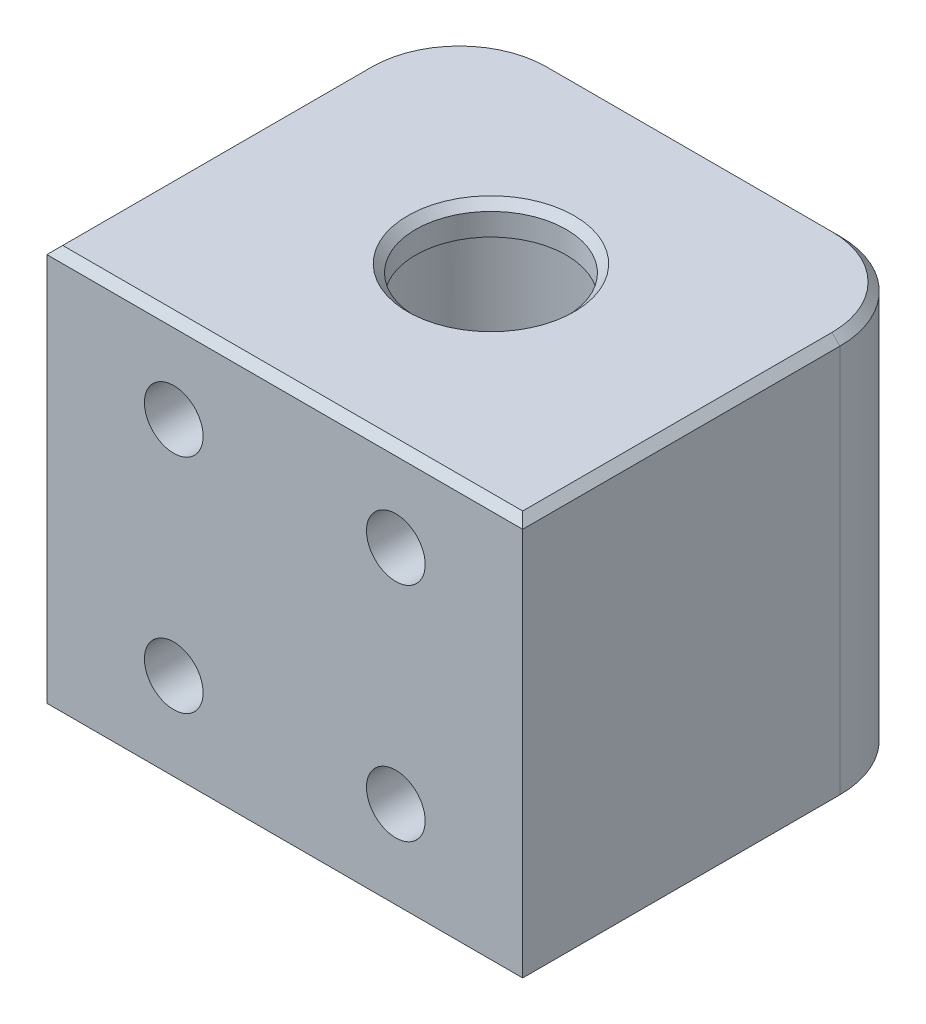
ISO-10303-21;
HEADER;
FILE_DESCRIPTION(('STEP AP214'),'2;1');
FILE_NAME('part.step','',(''),(''),'','','');
FILE_SCHEMA(('AUTOMOTIVE_DESIGN { 1 0 10303 214 1 1 1 1 }'));
ENDSEC;
DATA;
#1=APPLICATION_CONTEXT('core data for automotive mechanical design processes');
#2=APPLICATION_PROTOCOL_DEFINITION('international standard','automotive_design',2000,#1);
#3=PRODUCT_CONTEXT('',#1,'mechanical');
#4=PRODUCT('Part','Part','',(#3));
#5=PRODUCT_RELATED_PRODUCT_CATEGORY('part','',(#4));
#6=PRODUCT_DEFINITION_FORMATION('','',#4);
#7=PRODUCT_DEFINITION_CONTEXT('part definition',#1,'design');
#8=PRODUCT_DEFINITION('design','',#6,#7);
#9=PRODUCT_DEFINITION_SHAPE('','',#8);
#10=(LENGTH_UNIT() NAMED_UNIT(*) SI_UNIT(.MILLI.,.METRE.));
#11=(NAMED_UNIT(*) PLANE_ANGLE_UNIT() SI_UNIT($,.RADIAN.));
#12=(NAMED_UNIT(*) SI_UNIT($,.STERADIAN.) SOLID_ANGLE_UNIT());
#13=UNCERTAINTY_MEASURE_WITH_UNIT(LENGTH_MEASURE(1.E-05),#10,'distance_accuracy_value','');
#14=(GEOMETRIC_REPRESENTATION_CONTEXT(3) GLOBAL_UNCERTAINTY_ASSIGNED_CONTEXT((#13)) GLOBAL_UNIT_ASSIGNED_CONTEXT((#10,
#11,#12)) REPRESENTATION_CONTEXT('',''));
#15=CARTESIAN_POINT('',(0.,0.,0.));
#16=DIRECTION('',(0.,0.,1.));
#17=DIRECTION('',(1.,0.,0.));
#18=AXIS2_PLACEMENT_3D('',#15,#16,#17);
#19=CARTESIAN_POINT('',(13.0598621738516,3.5,6.3));
#20=DIRECTION('',(0.,0.,1.));
#21=DIRECTION('',(1.,0.,0.));
#22=AXIS2_PLACEMENT_3D('',#19,#20,#21);
#23=PLANE('',#22);
#24=DIRECTION('',(0.,-1.,0.));
#25=VECTOR('',#24,1.);
#26=CARTESIAN_POINT('',(-1.96723155729061,0.,6.3));
#27=LINE('',#26,#25);
#28=CARTESIAN_POINT('',(-1.96723155729061,0.,6.3));
#29=VERTEX_POINT('',#28);
#30=CARTESIAN_POINT('',(-1.96723155729061,3.5,6.3));
#31=VERTEX_POINT('',#30);
#32=EDGE_CURVE('E220',#29,#31,#27,.F.);
#33=ORIENTED_EDGE('',*,*,#32,.F.);
#34=DIRECTION('',(-1.,0.,0.));
#35=VECTOR('',#34,1.);
#36=CARTESIAN_POINT('',(13.0598621738516,0.,6.3));
#37=LINE('',#36,#35);
#38=CARTESIAN_POINT('',(-13.0598621738516,0.,6.3));
#39=VERTEX_POINT('',#38);
#40=EDGE_CURVE('E268',#29,#39,#37,.T.);
#41=ORIENTED_EDGE('',*,*,#40,.T.);
#42=DIRECTION('',(0.,-1.,0.));
#43=VECTOR('',#42,1.);
#44=CARTESIAN_POINT('',(-13.0598621738516,3.5,6.3));
#45=LINE('',#44,#43);
#46=CARTESIAN_POINT('',(-13.0598621738516,3.5,6.3));
#47=VERTEX_POINT('',#46);
#48=EDGE_CURVE('E271',#47,#39,#45,.T.);
#49=ORIENTED_EDGE('',*,*,#48,.F.);
#50=DIRECTION('',(-1.,0.,0.));
#51=VECTOR('',#50,1.);
#52=CARTESIAN_POINT('',(13.0598621738516,3.5,6.3));
#53=LINE('',#52,#51);
#54=EDGE_CURVE('E260',#31,#47,#53,.T.);
#55=ORIENTED_EDGE('',*,*,#54,.F.);
#56=EDGE_LOOP('',(#33,#41,#49,#55));
#57=FACE_BOUND('',#56,.T.);
#58=ADVANCED_FACE('F43',(#57),#23,.F.);
#59=DIRECTION('',(0.,-1.,0.));
#60=VECTOR('',#59,1.);
#61=CARTESIAN_POINT('',(1.96723155729061,0.,6.3));
#62=LINE('',#61,#60);
#63=CARTESIAN_POINT('',(1.96723155729061,3.5,6.3));
#64=VERTEX_POINT('',#63);
#65=CARTESIAN_POINT('',(1.96723155729061,0.,6.3));
#66=VERTEX_POINT('',#65);
#67=EDGE_CURVE('E214',#64,#66,#62,.T.);
#68=ORIENTED_EDGE('',*,*,#67,.F.);
#69=CARTESIAN_POINT('',(13.0598621738516,3.5,6.3));
#70=VERTEX_POINT('',#69);
#71=EDGE_CURVE('E257',#70,#64,#53,.T.);
#72=ORIENTED_EDGE('',*,*,#71,.F.);
#73=DIRECTION('',(0.,-1.,0.));
#74=VECTOR('',#73,1.);
#75=CARTESIAN_POINT('',(13.0598621738516,3.5,6.3));
#76=LINE('',#75,#74);
#77=CARTESIAN_POINT('',(13.0598621738516,0.,6.3));
#78=VERTEX_POINT('',#77);
#79=EDGE_CURVE('E280',#70,#78,#76,.T.);
#80=ORIENTED_EDGE('',*,*,#79,.T.);
#81=EDGE_CURVE('E249',#78,#66,#37,.T.);
#82=ORIENTED_EDGE('',*,*,#81,.T.);
#83=EDGE_LOOP('',(#68,#72,#80,#82));
#84=FACE_BOUND('',#83,.T.);
#85=ADVANCED_FACE('F411',(#84),#23,.F.);
#86=CARTESIAN_POINT('',(13.0598621738516,3.5,-6.3));
#87=DIRECTION('',(0.,0.,-1.));
#88=DIRECTION('',(-1.,0.,0.));
#89=AXIS2_PLACEMENT_3D('',#86,#87,#88);
#90=PLANE('',#89);
#91=DIRECTION('',(0.,-1.,0.));
#92=VECTOR('',#91,1.);
#93=CARTESIAN_POINT('',(1.9672315572906,0.,-6.3));
#94=LINE('',#93,#92);
#95=CARTESIAN_POINT('',(1.9672315572906,0.,-6.3));
#96=VERTEX_POINT('',#95);
#97=CARTESIAN_POINT('',(1.9672315572906,3.5,-6.3));
#98=VERTEX_POINT('',#97);
#99=EDGE_CURVE('E212',#96,#98,#94,.F.);
#100=ORIENTED_EDGE('',*,*,#99,.F.);
#101=DIRECTION('',(1.,0.,0.));
#102=VECTOR('',#101,1.);
#103=CARTESIAN_POINT('',(13.0598621738516,0.,-6.3));
#104=LINE('',#103,#102);
#105=CARTESIAN_POINT('',(13.0598621738516,0.,-6.3));
#106=VERTEX_POINT('',#105);
#107=EDGE_CURVE('E262',#96,#106,#104,.T.);
#108=ORIENTED_EDGE('',*,*,#107,.T.);
#109=DIRECTION('',(0.,-1.,0.));
#110=VECTOR('',#109,1.);
#111=CARTESIAN_POINT('',(13.0598621738516,3.5,-6.3));
#112=LINE('',#111,#110);
#113=CARTESIAN_POINT('',(13.0598621738516,3.5,-6.3));
#114=VERTEX_POINT('',#113);
#115=EDGE_CURVE('E278',#114,#106,#112,.T.);
#116=ORIENTED_EDGE('',*,*,#115,.F.);
#117=DIRECTION('',(1.,0.,0.));
#118=VECTOR('',#117,1.);
#119=CARTESIAN_POINT('',(13.0598621738516,3.5,-6.3));
#120=LINE('',#119,#118);
#121=EDGE_CURVE('E248',#98,#114,#120,.T.);
#122=ORIENTED_EDGE('',*,*,#121,.F.);
#123=EDGE_LOOP('',(#100,#108,#116,#122));
#124=FACE_BOUND('',#123,.T.);
#125=ADVANCED_FACE('F422',(#124),#90,.F.);
#126=DIRECTION('',(0.,-1.,0.));
#127=VECTOR('',#126,1.);
#128=CARTESIAN_POINT('',(-1.9672315572906,0.,-6.3));
#129=LINE('',#128,#127);
#130=CARTESIAN_POINT('',(-1.9672315572906,3.5,-6.3));
#131=VERTEX_POINT('',#130);
#132=CARTESIAN_POINT('',(-1.9672315572906,0.,-6.3));
#133=VERTEX_POINT('',#132);
#134=EDGE_CURVE('E219',#131,#133,#129,.T.);
#135=ORIENTED_EDGE('',*,*,#134,.F.);
#136=CARTESIAN_POINT('',(-13.0598621738516,3.5,-6.3));
#137=VERTEX_POINT('',#136);
#138=EDGE_CURVE('E252',#137,#131,#120,.T.);
#139=ORIENTED_EDGE('',*,*,#138,.F.);
#140=DIRECTION('',(0.,-1.,0.));
#141=VECTOR('',#140,1.);
#142=CARTESIAN_POINT('',(-13.0598621738516,3.5,-6.3));
#143=LINE('',#142,#141);
#144=CARTESIAN_POINT('',(-13.0598621738516,0.,-6.3));
#145=VERTEX_POINT('',#144);
#146=EDGE_CURVE('E263',#137,#145,#143,.T.);
#147=ORIENTED_EDGE('',*,*,#146,.T.);
#148=EDGE_CURVE('E265',#145,#133,#104,.T.);
#149=ORIENTED_EDGE('',*,*,#148,.T.);
#150=EDGE_LOOP('',(#135,#139,#147,#149));
#151=FACE_BOUND('',#150,.T.);
#152=ADVANCED_FACE('F436',(#151),#90,.F.);
#153=CARTESIAN_POINT('',(0.,3.5,0.));
#154=DIRECTION('',(0.,-1.,0.));
#155=DIRECTION('',(0.,0.,-1.));
#156=AXIS2_PLACEMENT_3D('',#153,#154,#155);
#157=PLANE('',#156);
#158=CARTESIAN_POINT('',(-9.25,3.5,0.));
#159=DIRECTION('',(0.,-1.,0.));
#160=DIRECTION('',(0.,0.,-1.));
#161=AXIS2_PLACEMENT_3D('',#158,#159,#160);
#162=CIRCLE('',#161,1.34999999999999);
#163=CARTESIAN_POINT('',(-9.25,3.5,-1.34999999999999));
#164=VERTEX_POINT('',#163);
#165=EDGE_CURVE('E193',#164,#164,#162,.T.);
#166=ORIENTED_EDGE('',*,*,#165,.F.);
#167=EDGE_LOOP('',(#166));
#168=FACE_BOUND('',#167,.T.);
#169=ORIENTED_EDGE('',*,*,#138,.T.);
#170=CARTESIAN_POINT('',(0.,3.5,0.));
#171=DIRECTION('',(0.,-1.,0.));
#172=DIRECTION('',(0.,0.,-1.));
#173=AXIS2_PLACEMENT_3D('',#170,#171,#172);
#174=CIRCLE('',#173,6.6);
#175=EDGE_CURVE('E305',#131,#31,#174,.F.);
#176=ORIENTED_EDGE('',*,*,#175,.T.);
#177=ORIENTED_EDGE('',*,*,#54,.T.);
#178=CARTESIAN_POINT('',(0.,3.5,0.));
#179=DIRECTION('',(0.,-1.,0.));
#180=DIRECTION('',(0.,0.,-1.));
#181=AXIS2_PLACEMENT_3D('',#178,#179,#180);
#182=CIRCLE('',#181,14.5);
#183=EDGE_CURVE('E246',#47,#137,#182,.T.);
#184=ORIENTED_EDGE('',*,*,#183,.T.);
#185=EDGE_LOOP('',(#169,#176,#177,#184));
#186=FACE_BOUND('',#185,.T.);
#187=ADVANCED_FACE('F458',(#168,#186),#157,.T.);
#188=CARTESIAN_POINT('',(-15.,25.,-13.));
#189=DIRECTION('',(1.,0.,0.));
#190=DIRECTION('',(0.,0.,-1.));
#191=AXIS2_PLACEMENT_3D('',#188,#189,#190);
#192=PLANE('',#191);
#193=DIRECTION('',(0.,-1.,0.));
#194=VECTOR('',#193,1.);
#195=CARTESIAN_POINT('',(-15.,25.,13.));
#196=LINE('',#195,#194);
#197=CARTESIAN_POINT('',(-15.,24.5,13.));
#198=VERTEX_POINT('',#197);
#199=CARTESIAN_POINT('',(-15.,0.,13.));
#200=VERTEX_POINT('',#199);
#201=EDGE_CURVE('E300',#198,#200,#196,.T.);
#202=ORIENTED_EDGE('',*,*,#201,.F.);
#203=DIRECTION('',(0.,0.,-1.));
#204=VECTOR('',#203,1.);
#205=CARTESIAN_POINT('',(-15.,24.5,-13.));
#206=LINE('',#205,#204);
#207=CARTESIAN_POINT('',(-15.,24.5,-7.));
#208=VERTEX_POINT('',#207);
#209=EDGE_CURVE('E331',#198,#208,#206,.T.);
#210=ORIENTED_EDGE('',*,*,#209,.T.);
#211=DIRECTION('',(0.,-1.,0.));
#212=VECTOR('',#211,1.);
#213=CARTESIAN_POINT('',(-15.,25.,-7.));
#214=LINE('',#213,#212);
#215=CARTESIAN_POINT('',(-15.,0.,-7.));
#216=VERTEX_POINT('',#215);
#217=EDGE_CURVE('E312',#208,#216,#214,.T.);
#218=ORIENTED_EDGE('',*,*,#217,.T.);
#219=DIRECTION('',(0.,0.,1.));
#220=VECTOR('',#219,1.);
#221=CARTESIAN_POINT('',(-15.,0.,-13.));
#222=LINE('',#221,#220);
#223=EDGE_CURVE('E276',#216,#200,#222,.T.);
#224=ORIENTED_EDGE('',*,*,#223,.T.);
#225=EDGE_LOOP('',(#202,#210,#218,#224));
#226=FACE_BOUND('',#225,.T.);
#227=ADVANCED_FACE('F393',(#226),#192,.F.);
#228=CARTESIAN_POINT('',(15.,25.,13.));
#229=DIRECTION('',(0.,0.,-1.));
#230=DIRECTION('',(-1.,0.,0.));
#231=AXIS2_PLACEMENT_3D('',#228,#229,#230);
#232=PLANE('',#231);
#233=CARTESIAN_POINT('',(7.,19.5,13.));
#234=DIRECTION('',(0.,0.,1.));
#235=DIRECTION('',(1.,0.,0.));
#236=AXIS2_PLACEMENT_3D('',#233,#234,#235);
#237=CIRCLE('',#236,1.85);
#238=CARTESIAN_POINT('',(8.85,19.5,13.));
#239=VERTEX_POINT('',#238);
#240=EDGE_CURVE('E222',#239,#239,#237,.T.);
#241=ORIENTED_EDGE('',*,*,#240,.F.);
#242=EDGE_LOOP('',(#241));
#243=FACE_BOUND('',#242,.T.);
#244=CARTESIAN_POINT('',(-7.,5.5,13.));
#245=DIRECTION('',(0.,0.,1.));
#246=DIRECTION('',(1.,0.,0.));
#247=AXIS2_PLACEMENT_3D('',#244,#245,#246);
#248=CIRCLE('',#247,1.85);
#249=CARTESIAN_POINT('',(-5.15,5.5,13.));
#250=VERTEX_POINT('',#249);
#251=EDGE_CURVE('E227',#250,#250,#248,.T.);
#252=ORIENTED_EDGE('',*,*,#251,.F.);
#253=EDGE_LOOP('',(#252));
#254=FACE_BOUND('',#253,.T.);
#255=CARTESIAN_POINT('',(-7.,19.5,13.));
#256=DIRECTION('',(0.,0.,1.));
#257=DIRECTION('',(1.,0.,0.));
#258=AXIS2_PLACEMENT_3D('',#255,#256,#257);
#259=CIRCLE('',#258,1.85);
#260=CARTESIAN_POINT('',(-5.15,19.5,13.));
#261=VERTEX_POINT('',#260);
#262=EDGE_CURVE('E231',#261,#261,#259,.T.);
#263=ORIENTED_EDGE('',*,*,#262,.F.);
#264=EDGE_LOOP('',(#263));
#265=FACE_BOUND('',#264,.T.);
#266=CARTESIAN_POINT('',(7.,5.5,13.));
#267=DIRECTION('',(0.,0.,1.));
#268=DIRECTION('',(1.,0.,0.));
#269=AXIS2_PLACEMENT_3D('',#266,#267,#268);
#270=CIRCLE('',#269,1.85);
#271=CARTESIAN_POINT('',(8.85,5.5,13.));
#272=VERTEX_POINT('',#271);
#273=EDGE_CURVE('E237',#272,#272,#270,.T.);
#274=ORIENTED_EDGE('',*,*,#273,.F.);
#275=EDGE_LOOP('',(#274));
#276=FACE_BOUND('',#275,.T.);
#277=DIRECTION('',(0.,-1.,0.));
#278=VECTOR('',#277,1.);
#279=CARTESIAN_POINT('',(15.,25.,13.));
#280=LINE('',#279,#278);
#281=CARTESIAN_POINT('',(15.,24.5,13.));
#282=VERTEX_POINT('',#281);
#283=CARTESIAN_POINT('',(15.,0.,13.));
#284=VERTEX_POINT('',#283);
#285=EDGE_CURVE('E294',#282,#284,#280,.T.);
#286=ORIENTED_EDGE('',*,*,#285,.F.);
#287=DIRECTION('',(-1.,0.,0.));
#288=VECTOR('',#287,1.);
#289=CARTESIAN_POINT('',(15.,24.5,13.));
#290=LINE('',#289,#288);
#291=EDGE_CURVE('E332',#282,#198,#290,.T.);
#292=ORIENTED_EDGE('',*,*,#291,.T.);
#293=ORIENTED_EDGE('',*,*,#201,.T.);
#294=DIRECTION('',(1.,0.,0.));
#295=VECTOR('',#294,1.);
#296=CARTESIAN_POINT('',(15.,0.,13.));
#297=LINE('',#296,#295);
#298=EDGE_CURVE('E287',#200,#284,#297,.T.);
#299=ORIENTED_EDGE('',*,*,#298,.T.);
#300=EDGE_LOOP('',(#286,#292,#293,#299));
#301=FACE_BOUND('',#300,.T.);
#302=ADVANCED_FACE('F380',(#243,#254,#265,#276,#301),#232,.F.);
#303=CARTESIAN_POINT('',(15.,25.,-13.));
#304=DIRECTION('',(-1.,0.,0.));
#305=DIRECTION('',(0.,0.,1.));
#306=AXIS2_PLACEMENT_3D('',#303,#304,#305);
#307=PLANE('',#306);
#308=DIRECTION('',(0.,-1.,0.));
#309=VECTOR('',#308,1.);
#310=CARTESIAN_POINT('',(15.,25.,-7.));
#311=LINE('',#310,#309);
#312=CARTESIAN_POINT('',(15.,0.,-7.00000000000001));
#313=VERTEX_POINT('',#312);
#314=CARTESIAN_POINT('',(15.,24.5,-7.));
#315=VERTEX_POINT('',#314);
#316=EDGE_CURVE('E311',#313,#315,#311,.F.);
#317=ORIENTED_EDGE('',*,*,#316,.T.);
#318=DIRECTION('',(0.,0.,1.));
#319=VECTOR('',#318,1.);
#320=CARTESIAN_POINT('',(15.,24.5,-13.));
#321=LINE('',#320,#319);
#322=EDGE_CURVE('E52',#315,#282,#321,.T.);
#323=ORIENTED_EDGE('',*,*,#322,.T.);
#324=ORIENTED_EDGE('',*,*,#285,.T.);
#325=DIRECTION('',(0.,0.,-1.));
#326=VECTOR('',#325,1.);
#327=CARTESIAN_POINT('',(15.,0.,-13.));
#328=LINE('',#327,#326);
#329=EDGE_CURVE('E286',#284,#313,#328,.T.);
#330=ORIENTED_EDGE('',*,*,#329,.T.);
#331=EDGE_LOOP('',(#317,#323,#324,#330));
#332=FACE_BOUND('',#331,.T.);
#333=ADVANCED_FACE('F372',(#332),#307,.F.);
#334=CARTESIAN_POINT('',(15.,25.,-13.));
#335=DIRECTION('',(0.,0.,1.));
#336=DIRECTION('',(1.,0.,0.));
#337=AXIS2_PLACEMENT_3D('',#334,#335,#336);
#338=PLANE('',#337);
#339=DIRECTION('',(0.,-1.,0.));
#340=VECTOR('',#339,1.);
#341=CARTESIAN_POINT('',(-9.,25.,-13.));
#342=LINE('',#341,#340);
#343=CARTESIAN_POINT('',(-9.,0.,-13.));
#344=VERTEX_POINT('',#343);
#345=CARTESIAN_POINT('',(-9.,24.5,-13.));
#346=VERTEX_POINT('',#345);
#347=EDGE_CURVE('E303',#344,#346,#342,.F.);
#348=ORIENTED_EDGE('',*,*,#347,.T.);
#349=DIRECTION('',(1.,0.,0.));
#350=VECTOR('',#349,1.);
#351=CARTESIAN_POINT('',(15.,24.5,-13.));
#352=LINE('',#351,#350);
#353=CARTESIAN_POINT('',(9.,24.5,-13.));
#354=VERTEX_POINT('',#353);
#355=EDGE_CURVE('E70',#346,#354,#352,.T.);
#356=ORIENTED_EDGE('',*,*,#355,.T.);
#357=DIRECTION('',(0.,-1.,0.));
#358=VECTOR('',#357,1.);
#359=CARTESIAN_POINT('',(9.,25.,-13.));
#360=LINE('',#359,#358);
#361=CARTESIAN_POINT('',(9.,0.,-13.));
#362=VERTEX_POINT('',#361);
#363=EDGE_CURVE('E304',#354,#362,#360,.T.);
#364=ORIENTED_EDGE('',*,*,#363,.T.);
#365=DIRECTION('',(-1.,0.,0.));
#366=VECTOR('',#365,1.);
#367=CARTESIAN_POINT('',(15.,0.,-13.));
#368=LINE('',#367,#366);
#369=EDGE_CURVE('E292',#362,#344,#368,.T.);
#370=ORIENTED_EDGE('',*,*,#369,.T.);
#371=EDGE_LOOP('',(#348,#356,#364,#370));
#372=FACE_BOUND('',#371,.T.);
#373=ADVANCED_FACE('F405',(#372),#338,.F.);
#374=CARTESIAN_POINT('',(0.,25.,0.));
#375=DIRECTION('',(0.,-1.,0.));
#376=DIRECTION('',(0.,0.,-1.));
#377=AXIS2_PLACEMENT_3D('',#374,#375,#376);
#378=PLANE('',#377);
#379=DIRECTION('',(0.,0.,1.));
#380=VECTOR('',#379,1.);
#381=CARTESIAN_POINT('',(-14.5,25.,0.));
#382=LINE('',#381,#380);
#383=CARTESIAN_POINT('',(-14.5,25.,-7.));
#384=VERTEX_POINT('',#383);
#385=CARTESIAN_POINT('',(-14.5,25.,12.5));
#386=VERTEX_POINT('',#385);
#387=EDGE_CURVE('E328',#384,#386,#382,.T.);
#388=ORIENTED_EDGE('',*,*,#387,.T.);
#389=DIRECTION('',(1.,0.,0.));
#390=VECTOR('',#389,1.);
#391=CARTESIAN_POINT('',(0.,25.,12.5));
#392=LINE('',#391,#390);
#393=CARTESIAN_POINT('',(14.5,25.,12.5));
#394=VERTEX_POINT('',#393);
#395=EDGE_CURVE('E327',#386,#394,#392,.T.);
#396=ORIENTED_EDGE('',*,*,#395,.T.);
#397=DIRECTION('',(0.,0.,-1.));
#398=VECTOR('',#397,1.);
#399=CARTESIAN_POINT('',(14.5,25.,0.));
#400=LINE('',#399,#398);
#401=CARTESIAN_POINT('',(14.5,25.,-7.));
#402=VERTEX_POINT('',#401);
#403=EDGE_CURVE('E319',#394,#402,#400,.T.);
#404=ORIENTED_EDGE('',*,*,#403,.T.);
#405=CARTESIAN_POINT('',(9.,25.,-7.));
#406=DIRECTION('',(0.,-1.,0.));
#407=DIRECTION('',(0.,0.,-1.));
#408=AXIS2_PLACEMENT_3D('',#405,#406,#407);
#409=CIRCLE('',#408,5.50000000000001);
#410=CARTESIAN_POINT('',(9.,25.,-12.5));
#411=VERTEX_POINT('',#410);
#412=EDGE_CURVE('E318',#402,#411,#409,.F.);
#413=ORIENTED_EDGE('',*,*,#412,.T.);
#414=DIRECTION('',(-1.,0.,0.));
#415=VECTOR('',#414,1.);
#416=CARTESIAN_POINT('',(0.,25.,-12.5));
#417=LINE('',#416,#415);
#418=CARTESIAN_POINT('',(-9.,25.,-12.5));
#419=VERTEX_POINT('',#418);
#420=EDGE_CURVE('E325',#411,#419,#417,.T.);
#421=ORIENTED_EDGE('',*,*,#420,.T.);
#422=CARTESIAN_POINT('',(-9.,25.,-7.));
#423=DIRECTION('',(0.,-1.,0.));
#424=DIRECTION('',(0.,0.,-1.));
#425=AXIS2_PLACEMENT_3D('',#422,#423,#424);
#426=CIRCLE('',#425,5.50000000000001);
#427=EDGE_CURVE('E323',#419,#384,#426,.F.);
#428=ORIENTED_EDGE('',*,*,#427,.T.);
#429=EDGE_LOOP('',(#388,#396,#404,#413,#421,#428));
#430=FACE_BOUND('',#429,.T.);
#431=CARTESIAN_POINT('',(0.,25.,0.));
#432=DIRECTION('',(0.,-1.,0.));
#433=DIRECTION('',(0.,0.,-1.));
#434=AXIS2_PLACEMENT_3D('',#431,#432,#433);
#435=CIRCLE('',#434,5.24999999999999);
#436=CARTESIAN_POINT('',(0.,25.,-5.24999999999999));
#437=VERTEX_POINT('',#436);
#438=EDGE_CURVE('E314',#437,#437,#435,.T.);
#439=ORIENTED_EDGE('',*,*,#438,.T.);
#440=EDGE_LOOP('',(#439));
#441=FACE_BOUND('',#440,.T.);
#442=ADVANCED_FACE('F404',(#430,#441),#378,.F.);
#443=CARTESIAN_POINT('',(0.,0.,0.));
#444=DIRECTION('',(0.,-1.,0.));
#445=DIRECTION('',(0.,0.,-1.));
#446=AXIS2_PLACEMENT_3D('',#443,#444,#445);
#447=PLANE('',#446);
#448=ORIENTED_EDGE('',*,*,#40,.F.);
#449=CARTESIAN_POINT('',(0.,0.,0.));
#450=DIRECTION('',(0.,-1.,0.));
#451=DIRECTION('',(0.,0.,-1.));
#452=AXIS2_PLACEMENT_3D('',#449,#450,#451);
#453=CIRCLE('',#452,6.6);
#454=EDGE_CURVE('E207',#66,#29,#453,.T.);
#455=ORIENTED_EDGE('',*,*,#454,.F.);
#456=ORIENTED_EDGE('',*,*,#81,.F.);
#457=CARTESIAN_POINT('',(0.,0.,0.));
#458=DIRECTION('',(0.,-1.,0.));
#459=DIRECTION('',(0.,0.,-1.));
#460=AXIS2_PLACEMENT_3D('',#457,#458,#459);
#461=CIRCLE('',#460,14.5);
#462=EDGE_CURVE('E270',#106,#78,#461,.T.);
#463=ORIENTED_EDGE('',*,*,#462,.F.);
#464=ORIENTED_EDGE('',*,*,#107,.F.);
#465=EDGE_CURVE('E201',#133,#96,#453,.T.);
#466=ORIENTED_EDGE('',*,*,#465,.F.);
#467=ORIENTED_EDGE('',*,*,#148,.F.);
#468=CARTESIAN_POINT('',(0.,0.,0.));
#469=DIRECTION('',(0.,-1.,0.));
#470=DIRECTION('',(0.,0.,-1.));
#471=AXIS2_PLACEMENT_3D('',#468,#469,#470);
#472=CIRCLE('',#471,14.5);
#473=EDGE_CURVE('E244',#39,#145,#472,.T.);
#474=ORIENTED_EDGE('',*,*,#473,.F.);
#475=EDGE_LOOP('',(#448,#455,#456,#463,#464,#466,#467,#474));
#476=FACE_BOUND('',#475,.T.);
#477=ORIENTED_EDGE('',*,*,#369,.F.);
#478=CARTESIAN_POINT('',(9.,0.,-7.));
#479=DIRECTION('',(0.,-1.,0.));
#480=DIRECTION('',(0.,0.,-1.));
#481=AXIS2_PLACEMENT_3D('',#478,#479,#480);
#482=CIRCLE('',#481,6.);
#483=EDGE_CURVE('E307',#362,#313,#482,.T.);
#484=ORIENTED_EDGE('',*,*,#483,.T.);
#485=ORIENTED_EDGE('',*,*,#329,.F.);
#486=ORIENTED_EDGE('',*,*,#298,.F.);
#487=ORIENTED_EDGE('',*,*,#223,.F.);
#488=CARTESIAN_POINT('',(-9.,0.,-7.));
#489=DIRECTION('',(0.,-1.,0.));
#490=DIRECTION('',(0.,0.,-1.));
#491=AXIS2_PLACEMENT_3D('',#488,#489,#490);
#492=CIRCLE('',#491,6.);
#493=EDGE_CURVE('E310',#216,#344,#492,.T.);
#494=ORIENTED_EDGE('',*,*,#493,.T.);
#495=EDGE_LOOP('',(#477,#484,#485,#486,#487,#494));
#496=FACE_BOUND('',#495,.T.);
#497=ADVANCED_FACE('F396',(#476,#496),#447,.T.);
#498=CARTESIAN_POINT('',(0.,3.5,0.));
#499=DIRECTION('',(0.,-1.,0.));
#500=DIRECTION('',(0.,0.,-1.));
#501=AXIS2_PLACEMENT_3D('',#498,#499,#500);
#502=CYLINDRICAL_SURFACE('',#501,14.5);
#503=ORIENTED_EDGE('',*,*,#473,.T.);
#504=ORIENTED_EDGE('',*,*,#146,.F.);
#505=ORIENTED_EDGE('',*,*,#183,.F.);
#506=ORIENTED_EDGE('',*,*,#48,.T.);
#507=EDGE_LOOP('',(#503,#504,#505,#506));
#508=FACE_BOUND('',#507,.T.);
#509=ADVANCED_FACE('F435',(#508),#502,.F.);
#510=CARTESIAN_POINT('',(0.,3.5,0.));
#511=DIRECTION('',(0.,-1.,0.));
#512=DIRECTION('',(0.,0.,-1.));
#513=AXIS2_PLACEMENT_3D('',#510,#511,#512);
#514=CYLINDRICAL_SURFACE('',#513,14.5);
#515=ORIENTED_EDGE('',*,*,#462,.T.);
#516=ORIENTED_EDGE('',*,*,#79,.F.);
#517=CARTESIAN_POINT('',(0.,3.5,0.));
#518=DIRECTION('',(0.,-1.,0.));
#519=DIRECTION('',(0.,0.,-1.));
#520=AXIS2_PLACEMENT_3D('',#517,#518,#519);
#521=CIRCLE('',#520,14.5);
#522=EDGE_CURVE('E251',#114,#70,#521,.T.);
#523=ORIENTED_EDGE('',*,*,#522,.F.);
#524=ORIENTED_EDGE('',*,*,#115,.T.);
#525=EDGE_LOOP('',(#515,#516,#523,#524));
#526=FACE_BOUND('',#525,.T.);
#527=ADVANCED_FACE('F429',(#526),#514,.F.);
#528=CARTESIAN_POINT('',(9.25,3.5,0.));
#529=DIRECTION('',(0.,-1.,0.));
#530=DIRECTION('',(0.,0.,-1.));
#531=AXIS2_PLACEMENT_3D('',#528,#529,#530);
#532=CIRCLE('',#531,1.34999999999999);
#533=CARTESIAN_POINT('',(9.25,3.5,-1.34999999999999));
#534=VERTEX_POINT('',#533);
#535=EDGE_CURVE('E192',#534,#534,#532,.T.);
#536=ORIENTED_EDGE('',*,*,#535,.F.);
#537=EDGE_LOOP('',(#536));
#538=FACE_BOUND('',#537,.T.);
#539=ORIENTED_EDGE('',*,*,#71,.T.);
#540=EDGE_CURVE('E299',#64,#98,#174,.F.);
#541=ORIENTED_EDGE('',*,*,#540,.T.);
#542=ORIENTED_EDGE('',*,*,#121,.T.);
#543=ORIENTED_EDGE('',*,*,#522,.T.);
#544=EDGE_LOOP('',(#539,#541,#542,#543));
#545=FACE_BOUND('',#544,.T.);
#546=ADVANCED_FACE('F430',(#538,#545),#157,.T.);
#547=CARTESIAN_POINT('',(7.,5.5,9.));
#548=DIRECTION('',(0.,0.,1.));
#549=DIRECTION('',(1.,0.,0.));
#550=AXIS2_PLACEMENT_3D('',#547,#548,#549);
#551=CONICAL_SURFACE('',#550,1.85,1.02974425867665);
#552=CARTESIAN_POINT('',(7.,5.5,7.88840785479901));
#553=VERTEX_POINT('',#552);
#554=VERTEX_LOOP('',#553);
#555=FACE_BOUND('',#554,.T.);
#556=CARTESIAN_POINT('',(7.,5.5,9.));
#557=DIRECTION('',(0.,0.,1.));
#558=DIRECTION('',(1.,0.,0.));
#559=AXIS2_PLACEMENT_3D('',#556,#557,#558);
#560=CIRCLE('',#559,1.85);
#561=CARTESIAN_POINT('',(8.85,5.5,9.));
#562=VERTEX_POINT('',#561);
#563=EDGE_CURVE('E245',#562,#562,#560,.T.);
#564=ORIENTED_EDGE('',*,*,#563,.T.);
#565=EDGE_LOOP('',(#564));
#566=FACE_BOUND('',#565,.T.);
#567=ADVANCED_FACE('F472',(#555,#566),#551,.F.);
#568=CARTESIAN_POINT('',(7.,5.5,13.));
#569=DIRECTION('',(0.,0.,1.));
#570=DIRECTION('',(1.,0.,0.));
#571=AXIS2_PLACEMENT_3D('',#568,#569,#570);
#572=CYLINDRICAL_SURFACE('',#571,1.85);
#573=ORIENTED_EDGE('',*,*,#563,.F.);
#574=EDGE_LOOP('',(#573));
#575=FACE_BOUND('',#574,.T.);
#576=ORIENTED_EDGE('',*,*,#273,.T.);
#577=EDGE_LOOP('',(#576));
#578=FACE_BOUND('',#577,.T.);
#579=ADVANCED_FACE('F476',(#575,#578),#572,.F.);
#580=CARTESIAN_POINT('',(-7.,19.5,9.));
#581=DIRECTION('',(0.,0.,1.));
#582=DIRECTION('',(1.,0.,0.));
#583=AXIS2_PLACEMENT_3D('',#580,#581,#582);
#584=CONICAL_SURFACE('',#583,1.85,1.02974425867665);
#585=CARTESIAN_POINT('',(-7.,19.5,7.88840785479901));
#586=VERTEX_POINT('',#585);
#587=VERTEX_LOOP('',#586);
#588=FACE_BOUND('',#587,.T.);
#589=CARTESIAN_POINT('',(-7.,19.5,9.));
#590=DIRECTION('',(0.,0.,1.));
#591=DIRECTION('',(1.,0.,0.));
#592=AXIS2_PLACEMENT_3D('',#589,#590,#591);
#593=CIRCLE('',#592,1.85);
#594=CARTESIAN_POINT('',(-5.15,19.5,9.));
#595=VERTEX_POINT('',#594);
#596=EDGE_CURVE('E236',#595,#595,#593,.T.);
#597=ORIENTED_EDGE('',*,*,#596,.T.);
#598=EDGE_LOOP('',(#597));
#599=FACE_BOUND('',#598,.T.);
#600=ADVANCED_FACE('F532',(#588,#599),#584,.F.);
#601=CARTESIAN_POINT('',(-7.,19.5,13.));
#602=DIRECTION('',(0.,0.,1.));
#603=DIRECTION('',(1.,0.,0.));
#604=AXIS2_PLACEMENT_3D('',#601,#602,#603);
#605=CYLINDRICAL_SURFACE('',#604,1.85);
#606=ORIENTED_EDGE('',*,*,#596,.F.);
#607=EDGE_LOOP('',(#606));
#608=FACE_BOUND('',#607,.T.);
#609=ORIENTED_EDGE('',*,*,#262,.T.);
#610=EDGE_LOOP('',(#609));
#611=FACE_BOUND('',#610,.T.);
#612=ADVANCED_FACE('F530',(#608,#611),#605,.F.);
#613=CARTESIAN_POINT('',(-7.,5.5,9.));
#614=DIRECTION('',(0.,0.,1.));
#615=DIRECTION('',(1.,0.,0.));
#616=AXIS2_PLACEMENT_3D('',#613,#614,#615);
#617=CONICAL_SURFACE('',#616,1.85,1.02974425867665);
#618=CARTESIAN_POINT('',(-7.,5.5,7.88840785479901));
#619=VERTEX_POINT('',#618);
#620=VERTEX_LOOP('',#619);
#621=FACE_BOUND('',#620,.T.);
#622=CARTESIAN_POINT('',(-7.,5.5,9.));
#623=DIRECTION('',(0.,0.,1.));
#624=DIRECTION('',(1.,0.,0.));
#625=AXIS2_PLACEMENT_3D('',#622,#623,#624);
#626=CIRCLE('',#625,1.85);
#627=CARTESIAN_POINT('',(-5.15,5.5,9.));
#628=VERTEX_POINT('',#627);
#629=EDGE_CURVE('E229',#628,#628,#626,.T.);
#630=ORIENTED_EDGE('',*,*,#629,.T.);
#631=EDGE_LOOP('',(#630));
#632=FACE_BOUND('',#631,.T.);
#633=ADVANCED_FACE('F522',(#621,#632),#617,.F.);
#634=CARTESIAN_POINT('',(-7.,5.5,13.));
#635=DIRECTION('',(0.,0.,1.));
#636=DIRECTION('',(1.,0.,0.));
#637=AXIS2_PLACEMENT_3D('',#634,#635,#636);
#638=CYLINDRICAL_SURFACE('',#637,1.85);
#639=ORIENTED_EDGE('',*,*,#629,.F.);
#640=EDGE_LOOP('',(#639));
#641=FACE_BOUND('',#640,.T.);
#642=ORIENTED_EDGE('',*,*,#251,.T.);
#643=EDGE_LOOP('',(#642));
#644=FACE_BOUND('',#643,.T.);
#645=ADVANCED_FACE('F518',(#641,#644),#638,.F.);
#646=CARTESIAN_POINT('',(7.,19.5,9.));
#647=DIRECTION('',(0.,0.,1.));
#648=DIRECTION('',(1.,0.,0.));
#649=AXIS2_PLACEMENT_3D('',#646,#647,#648);
#650=CONICAL_SURFACE('',#649,1.85,1.02974425867665);
#651=CARTESIAN_POINT('',(7.,19.5,7.88840785479901));
#652=VERTEX_POINT('',#651);
#653=VERTEX_LOOP('',#652);
#654=FACE_BOUND('',#653,.T.);
#655=CARTESIAN_POINT('',(7.,19.5,9.));
#656=DIRECTION('',(0.,0.,1.));
#657=DIRECTION('',(1.,0.,0.));
#658=AXIS2_PLACEMENT_3D('',#655,#656,#657);
#659=CIRCLE('',#658,1.85);
#660=CARTESIAN_POINT('',(8.85,19.5,9.));
#661=VERTEX_POINT('',#660);
#662=EDGE_CURVE('E221',#661,#661,#659,.T.);
#663=ORIENTED_EDGE('',*,*,#662,.T.);
#664=EDGE_LOOP('',(#663));
#665=FACE_BOUND('',#664,.T.);
#666=ADVANCED_FACE('F513',(#654,#665),#650,.F.);
#667=CARTESIAN_POINT('',(7.,19.5,13.));
#668=DIRECTION('',(0.,0.,1.));
#669=DIRECTION('',(1.,0.,0.));
#670=AXIS2_PLACEMENT_3D('',#667,#668,#669);
#671=CYLINDRICAL_SURFACE('',#670,1.85);
#672=ORIENTED_EDGE('',*,*,#662,.F.);
#673=EDGE_LOOP('',(#672));
#674=FACE_BOUND('',#673,.T.);
#675=ORIENTED_EDGE('',*,*,#240,.T.);
#676=EDGE_LOOP('',(#675));
#677=FACE_BOUND('',#676,.T.);
#678=ADVANCED_FACE('F510',(#674,#677),#671,.F.);
#679=CARTESIAN_POINT('',(0.,0.,0.));
#680=DIRECTION('',(0.,-1.,0.));
#681=DIRECTION('',(0.,0.,-1.));
#682=AXIS2_PLACEMENT_3D('',#679,#680,#681);
#683=CYLINDRICAL_SURFACE('',#682,6.6);
#684=CARTESIAN_POINT('',(0.,23.1,0.));
#685=DIRECTION('',(0.,-1.,0.));
#686=DIRECTION('',(0.,0.,-1.));
#687=AXIS2_PLACEMENT_3D('',#684,#685,#686);
#688=CIRCLE('',#687,6.6);
#689=CARTESIAN_POINT('',(0.,23.1,-6.6));
#690=VERTEX_POINT('',#689);
#691=EDGE_CURVE('E210',#690,#690,#688,.T.);
#692=ORIENTED_EDGE('',*,*,#691,.F.);
#693=EDGE_LOOP('',(#692));
#694=FACE_BOUND('',#693,.T.);
#695=ORIENTED_EDGE('',*,*,#32,.T.);
#696=ORIENTED_EDGE('',*,*,#175,.F.);
#697=ORIENTED_EDGE('',*,*,#134,.T.);
#698=ORIENTED_EDGE('',*,*,#465,.T.);
#699=ORIENTED_EDGE('',*,*,#99,.T.);
#700=ORIENTED_EDGE('',*,*,#540,.F.);
#701=ORIENTED_EDGE('',*,*,#67,.T.);
#702=ORIENTED_EDGE('',*,*,#454,.T.);
#703=EDGE_LOOP('',(#695,#696,#697,#698,#699,#700,#701,#702));
#704=FACE_BOUND('',#703,.T.);
#705=ADVANCED_FACE('F456',(#694,#704),#683,.F.);
#706=CARTESIAN_POINT('',(0.,0.,0.));
#707=DIRECTION('',(0.,-1.,0.));
#708=DIRECTION('',(0.,0.,-1.));
#709=AXIS2_PLACEMENT_3D('',#706,#707,#708);
#710=CYLINDRICAL_SURFACE('',#709,4.75);
#711=CARTESIAN_POINT('',(0.,24.5,0.));
#712=DIRECTION('',(0.,-1.,0.));
#713=DIRECTION('',(0.,0.,-1.));
#714=AXIS2_PLACEMENT_3D('',#711,#712,#713);
#715=CIRCLE('',#714,4.75);
#716=CARTESIAN_POINT('',(0.,24.5,-4.75));
#717=VERTEX_POINT('',#716);
#718=EDGE_CURVE('E11',#717,#717,#715,.F.);
#719=ORIENTED_EDGE('',*,*,#718,.T.);
#720=EDGE_LOOP('',(#719));
#721=FACE_BOUND('',#720,.T.);
#722=CARTESIAN_POINT('',(0.,23.1,0.));
#723=DIRECTION('',(0.,-1.,0.));
#724=DIRECTION('',(0.,0.,-1.));
#725=AXIS2_PLACEMENT_3D('',#722,#723,#724);
#726=CIRCLE('',#725,4.75);
#727=CARTESIAN_POINT('',(0.,23.1,-4.75));
#728=VERTEX_POINT('',#727);
#729=EDGE_CURVE('E208',#728,#728,#726,.T.);
#730=ORIENTED_EDGE('',*,*,#729,.T.);
#731=EDGE_LOOP('',(#730));
#732=FACE_BOUND('',#731,.T.);
#733=ADVANCED_FACE('F506',(#721,#732),#710,.F.);
#734=CARTESIAN_POINT('',(-6.6,23.1,0.));
#735=DIRECTION('',(0.,-1.,0.));
#736=DIRECTION('',(0.,0.,-1.));
#737=AXIS2_PLACEMENT_3D('',#734,#735,#736);
#738=PLANE('',#737);
#739=ORIENTED_EDGE('',*,*,#691,.T.);
#740=EDGE_LOOP('',(#739));
#741=FACE_BOUND('',#740,.T.);
#742=ORIENTED_EDGE('',*,*,#729,.F.);
#743=EDGE_LOOP('',(#742));
#744=FACE_BOUND('',#743,.T.);
#745=ADVANCED_FACE('F505',(#741,#744),#738,.T.);
#746=CARTESIAN_POINT('',(9.25,15.5,0.));
#747=DIRECTION('',(0.,-1.,0.));
#748=DIRECTION('',(0.,0.,-1.));
#749=AXIS2_PLACEMENT_3D('',#746,#747,#748);
#750=CONICAL_SURFACE('',#749,1.35,1.02974425867665);
#751=CARTESIAN_POINT('',(9.25,16.3111618356872,0.));
#752=VERTEX_POINT('',#751);
#753=VERTEX_LOOP('',#752);
#754=FACE_BOUND('',#753,.T.);
#755=CARTESIAN_POINT('',(9.25,15.5,0.));
#756=DIRECTION('',(0.,-1.,0.));
#757=DIRECTION('',(0.,0.,-1.));
#758=AXIS2_PLACEMENT_3D('',#755,#756,#757);
#759=CIRCLE('',#758,1.35);
#760=CARTESIAN_POINT('',(9.25,15.5,-1.34999999999999));
#761=VERTEX_POINT('',#760);
#762=EDGE_CURVE('E199',#761,#761,#759,.T.);
#763=ORIENTED_EDGE('',*,*,#762,.T.);
#764=EDGE_LOOP('',(#763));
#765=FACE_BOUND('',#764,.T.);
#766=ADVANCED_FACE('F497',(#754,#765),#750,.F.);
#767=CARTESIAN_POINT('',(9.25,3.5,0.));
#768=DIRECTION('',(0.,-1.,0.));
#769=DIRECTION('',(0.,0.,-1.));
#770=AXIS2_PLACEMENT_3D('',#767,#768,#769);
#771=CYLINDRICAL_SURFACE('',#770,1.34999999999999);
#772=ORIENTED_EDGE('',*,*,#762,.F.);
#773=EDGE_LOOP('',(#772));
#774=FACE_BOUND('',#773,.T.);
#775=ORIENTED_EDGE('',*,*,#535,.T.);
#776=EDGE_LOOP('',(#775));
#777=FACE_BOUND('',#776,.T.);
#778=ADVANCED_FACE('F190',(#774,#777),#771,.F.);
#779=CARTESIAN_POINT('',(-9.25,15.5,0.));
#780=DIRECTION('',(0.,-1.,0.));
#781=DIRECTION('',(0.,0.,-1.));
#782=AXIS2_PLACEMENT_3D('',#779,#780,#781);
#783=CONICAL_SURFACE('',#782,1.35,1.02974425867665);
#784=CARTESIAN_POINT('',(-9.25,16.3111618356872,0.));
#785=VERTEX_POINT('',#784);
#786=VERTEX_LOOP('',#785);
#787=FACE_BOUND('',#786,.T.);
#788=CARTESIAN_POINT('',(-9.25,15.5,0.));
#789=DIRECTION('',(0.,-1.,0.));
#790=DIRECTION('',(0.,0.,-1.));
#791=AXIS2_PLACEMENT_3D('',#788,#789,#790);
#792=CIRCLE('',#791,1.35);
#793=CARTESIAN_POINT('',(-9.25,15.5,-1.35));
#794=VERTEX_POINT('',#793);
#795=EDGE_CURVE('E191',#794,#794,#792,.T.);
#796=ORIENTED_EDGE('',*,*,#795,.T.);
#797=EDGE_LOOP('',(#796));
#798=FACE_BOUND('',#797,.T.);
#799=ADVANCED_FACE('F182',(#787,#798),#783,.F.);
#800=CARTESIAN_POINT('',(-9.25,3.5,0.));
#801=DIRECTION('',(0.,-1.,0.));
#802=DIRECTION('',(0.,0.,-1.));
#803=AXIS2_PLACEMENT_3D('',#800,#801,#802);
#804=CYLINDRICAL_SURFACE('',#803,1.34999999999999);
#805=ORIENTED_EDGE('',*,*,#795,.F.);
#806=EDGE_LOOP('',(#805));
#807=FACE_BOUND('',#806,.T.);
#808=ORIENTED_EDGE('',*,*,#165,.T.);
#809=EDGE_LOOP('',(#808));
#810=FACE_BOUND('',#809,.T.);
#811=ADVANCED_FACE('F187',(#807,#810),#804,.F.);
#812=CARTESIAN_POINT('',(9.,25.,-7.));
#813=DIRECTION('',(0.,-1.,0.));
#814=DIRECTION('',(0.,0.,-1.));
#815=AXIS2_PLACEMENT_3D('',#812,#813,#814);
#816=CYLINDRICAL_SURFACE('',#815,6.);
#817=ORIENTED_EDGE('',*,*,#363,.F.);
#818=CARTESIAN_POINT('',(9.,24.5,-7.));
#819=DIRECTION('',(0.,-1.,0.));
#820=DIRECTION('',(0.,0.,-1.));
#821=AXIS2_PLACEMENT_3D('',#818,#819,#820);
#822=CIRCLE('',#821,6.);
#823=EDGE_CURVE('E61',#354,#315,#822,.T.);
#824=ORIENTED_EDGE('',*,*,#823,.T.);
#825=ORIENTED_EDGE('',*,*,#316,.F.);
#826=ORIENTED_EDGE('',*,*,#483,.F.);
#827=EDGE_LOOP('',(#817,#824,#825,#826));
#828=FACE_BOUND('',#827,.T.);
#829=ADVANCED_FACE('F402',(#828),#816,.T.);
#830=CARTESIAN_POINT('',(-9.,25.,-7.));
#831=DIRECTION('',(0.,-1.,0.));
#832=DIRECTION('',(0.,0.,-1.));
#833=AXIS2_PLACEMENT_3D('',#830,#831,#832);
#834=CYLINDRICAL_SURFACE('',#833,6.);
#835=ORIENTED_EDGE('',*,*,#217,.F.);
#836=CARTESIAN_POINT('',(-9.,24.5,-7.));
#837=DIRECTION('',(0.,-1.,0.));
#838=DIRECTION('',(0.,0.,-1.));
#839=AXIS2_PLACEMENT_3D('',#836,#837,#838);
#840=CIRCLE('',#839,6.);
#841=EDGE_CURVE('E337',#208,#346,#840,.T.);
#842=ORIENTED_EDGE('',*,*,#841,.T.);
#843=ORIENTED_EDGE('',*,*,#347,.F.);
#844=ORIENTED_EDGE('',*,*,#493,.F.);
#845=EDGE_LOOP('',(#835,#842,#843,#844));
#846=FACE_BOUND('',#845,.T.);
#847=ADVANCED_FACE('F395',(#846),#834,.T.);
#848=CARTESIAN_POINT('',(0.,25.,-12.5));
#849=DIRECTION('',(0.,-0.707106781186543,0.707106781186552));
#850=DIRECTION('',(-1.,0.,0.));
#851=AXIS2_PLACEMENT_3D('',#848,#849,#850);
#852=PLANE('',#851);
#853=DIRECTION('',(0.,0.707106781186551,0.707106781186544));
#854=VECTOR('',#853,1.);
#855=CARTESIAN_POINT('',(9.,24.5,-13.));
#856=LINE('',#855,#854);
#857=EDGE_CURVE('E346',#354,#411,#856,.T.);
#858=ORIENTED_EDGE('',*,*,#857,.F.);
#859=ORIENTED_EDGE('',*,*,#355,.F.);
#860=DIRECTION('',(0.,-0.707106781186552,-0.707106781186543));
#861=VECTOR('',#860,1.);
#862=CARTESIAN_POINT('',(-9.,25.,-12.5));
#863=LINE('',#862,#861);
#864=EDGE_CURVE('E48',#419,#346,#863,.T.);
#865=ORIENTED_EDGE('',*,*,#864,.F.);
#866=ORIENTED_EDGE('',*,*,#420,.F.);
#867=EDGE_LOOP('',(#858,#859,#865,#866));
#868=FACE_BOUND('',#867,.T.);
#869=ADVANCED_FACE('F364',(#868),#852,.F.);
#870=CARTESIAN_POINT('',(-9.,25.,-7.));
#871=DIRECTION('',(0.,-1.,0.));
#872=DIRECTION('',(0.,0.,-1.));
#873=AXIS2_PLACEMENT_3D('',#870,#871,#872);
#874=CONICAL_SURFACE('',#873,5.50000000000001,0.785398163397441);
#875=ORIENTED_EDGE('',*,*,#864,.T.);
#876=ORIENTED_EDGE('',*,*,#841,.F.);
#877=DIRECTION('',(-0.707106781186543,-0.707106781186552,0.));
#878=VECTOR('',#877,1.);
#879=CARTESIAN_POINT('',(-14.5,25.,-7.));
#880=LINE('',#879,#878);
#881=EDGE_CURVE('E347',#384,#208,#880,.T.);
#882=ORIENTED_EDGE('',*,*,#881,.F.);
#883=ORIENTED_EDGE('',*,*,#427,.F.);
#884=EDGE_LOOP('',(#875,#876,#882,#883));
#885=FACE_BOUND('',#884,.T.);
#886=ADVANCED_FACE('F359',(#885),#874,.T.);
#887=CARTESIAN_POINT('',(9.,25.,-7.));
#888=DIRECTION('',(0.,-1.,0.));
#889=DIRECTION('',(0.,0.,-1.));
#890=AXIS2_PLACEMENT_3D('',#887,#888,#889);
#891=CONICAL_SURFACE('',#890,5.50000000000001,0.785398163397441);
#892=ORIENTED_EDGE('',*,*,#857,.T.);
#893=ORIENTED_EDGE('',*,*,#412,.F.);
#894=DIRECTION('',(-0.707106781186541,0.707106781186554,0.));
#895=VECTOR('',#894,1.);
#896=CARTESIAN_POINT('',(15.,24.5,-7.));
#897=LINE('',#896,#895);
#898=EDGE_CURVE('E344',#315,#402,#897,.T.);
#899=ORIENTED_EDGE('',*,*,#898,.F.);
#900=ORIENTED_EDGE('',*,*,#823,.F.);
#901=EDGE_LOOP('',(#892,#893,#899,#900));
#902=FACE_BOUND('',#901,.T.);
#903=ADVANCED_FACE('F366',(#902),#891,.T.);
#904=CARTESIAN_POINT('',(-14.5,25.,0.));
#905=DIRECTION('',(0.707106781186554,-0.707106781186541,0.));
#906=DIRECTION('',(0.,0.,1.));
#907=AXIS2_PLACEMENT_3D('',#904,#905,#906);
#908=PLANE('',#907);
#909=ORIENTED_EDGE('',*,*,#881,.T.);
#910=ORIENTED_EDGE('',*,*,#209,.F.);
#911=DIRECTION('',(0.577350269189622,0.577350269189632,-0.577350269189624));
#912=VECTOR('',#911,1.);
#913=CARTESIAN_POINT('',(-10.3333333333334,29.1666666666667,8.33333333333336));
#914=LINE('',#913,#912);
#915=EDGE_CURVE('E342',#386,#198,#914,.F.);
#916=ORIENTED_EDGE('',*,*,#915,.F.);
#917=ORIENTED_EDGE('',*,*,#387,.F.);
#918=EDGE_LOOP('',(#909,#910,#916,#917));
#919=FACE_BOUND('',#918,.T.);
#920=ADVANCED_FACE('F387',(#919),#908,.F.);
#921=CARTESIAN_POINT('',(14.5,25.,0.));
#922=DIRECTION('',(-0.707106781186552,-0.707106781186543,0.));
#923=DIRECTION('',(0.,0.,-1.));
#924=AXIS2_PLACEMENT_3D('',#921,#922,#923);
#925=PLANE('',#924);
#926=ORIENTED_EDGE('',*,*,#898,.T.);
#927=ORIENTED_EDGE('',*,*,#403,.F.);
#928=DIRECTION('',(0.577350269189623,-0.577350269189631,0.577350269189623));
#929=VECTOR('',#928,1.);
#930=CARTESIAN_POINT('',(10.3333333333334,29.1666666666667,8.33333333333337));
#931=LINE('',#930,#929);
#932=EDGE_CURVE('E341',#282,#394,#931,.F.);
#933=ORIENTED_EDGE('',*,*,#932,.F.);
#934=ORIENTED_EDGE('',*,*,#322,.F.);
#935=EDGE_LOOP('',(#926,#927,#933,#934));
#936=FACE_BOUND('',#935,.T.);
#937=ADVANCED_FACE('F371',(#936),#925,.F.);
#938=CARTESIAN_POINT('',(0.,25.,12.5));
#939=DIRECTION('',(0.,-0.707106781186543,-0.707106781186552));
#940=DIRECTION('',(1.,0.,0.));
#941=AXIS2_PLACEMENT_3D('',#938,#939,#940);
#942=PLANE('',#941);
#943=ORIENTED_EDGE('',*,*,#915,.T.);
#944=ORIENTED_EDGE('',*,*,#291,.F.);
#945=ORIENTED_EDGE('',*,*,#932,.T.);
#946=ORIENTED_EDGE('',*,*,#395,.F.);
#947=EDGE_LOOP('',(#943,#944,#945,#946));
#948=FACE_BOUND('',#947,.T.);
#949=ADVANCED_FACE('F385',(#948),#942,.F.);
#950=CARTESIAN_POINT('',(0.,25.,0.));
#951=DIRECTION('',(0.,1.,0.));
#952=DIRECTION('',(0.,0.,1.));
#953=AXIS2_PLACEMENT_3D('',#950,#951,#952);
#954=CONICAL_SURFACE('',#953,5.24999999999999,0.785398163397443);
#955=ORIENTED_EDGE('',*,*,#718,.F.);
#956=EDGE_LOOP('',(#955));
#957=FACE_BOUND('',#956,.T.);
#958=ORIENTED_EDGE('',*,*,#438,.F.);
#959=EDGE_LOOP('',(#958));
#960=FACE_BOUND('',#959,.T.);
#961=ADVANCED_FACE('F46',(#957,#960),#954,.F.);
#962=CLOSED_SHELL('',(#58,#85,#125,#152,#187,#227,#302,#333,#373,#442,#497,#509,#527,#546,#567,
#579,#600,#612,#633,#645,#666,#678,#705,#733,#745,#766,#778,#799,#811,#829,#847,#869,#886,#903,
#920,#937,#949,#961));
#963=MANIFOLD_SOLID_BREP('B2',#962);
#964=ADVANCED_BREP_SHAPE_REPRESENTATION('',(#18,#963),#14);
#965=SHAPE_DEFINITION_REPRESENTATION(#9,#964);
ENDSEC;
END-ISO-10303-21;
